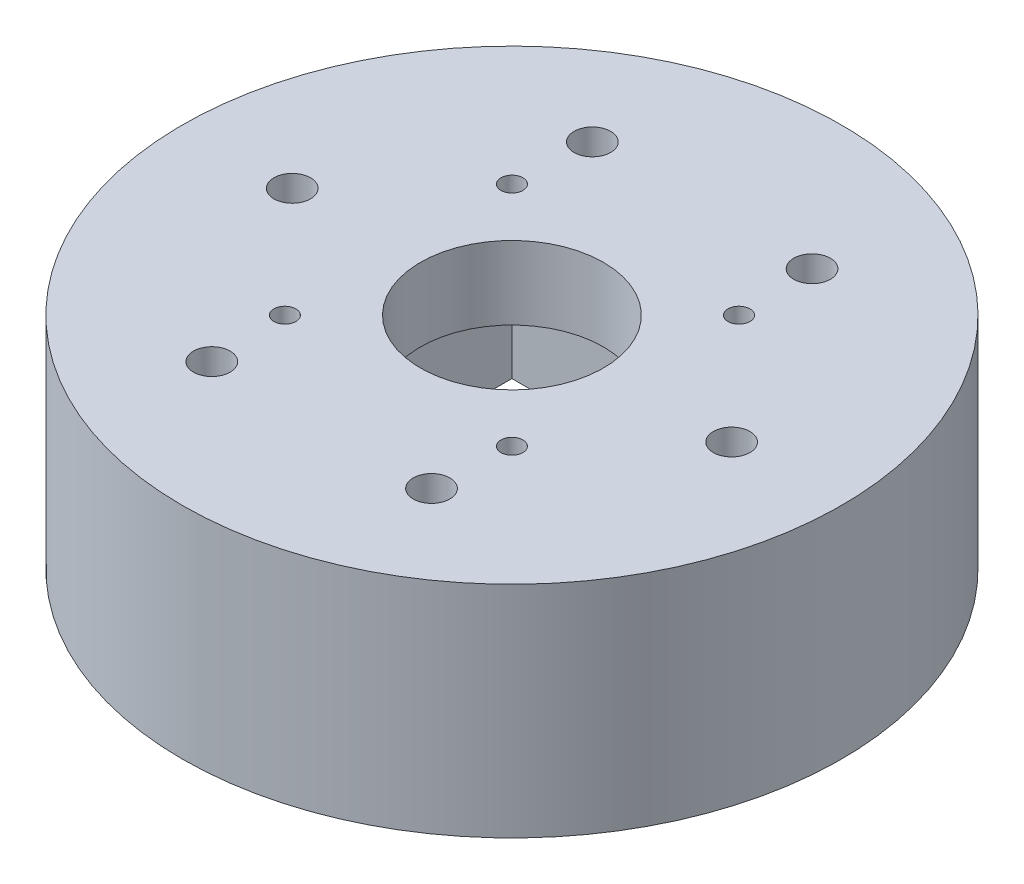
ISO-10303-21;
HEADER;
FILE_DESCRIPTION(('STEP AP214'),'2;1');
FILE_NAME('part.step','',(''),(''),'','','');
FILE_SCHEMA(('AUTOMOTIVE_DESIGN { 1 0 10303 214 1 1 1 1 }'));
ENDSEC;
DATA;
#1=APPLICATION_CONTEXT('core data for automotive mechanical design processes');
#2=APPLICATION_PROTOCOL_DEFINITION('international standard','automotive_design',2000,#1);
#3=PRODUCT_CONTEXT('',#1,'mechanical');
#4=PRODUCT('Part','Part','',(#3));
#5=PRODUCT_RELATED_PRODUCT_CATEGORY('part','',(#4));
#6=PRODUCT_DEFINITION_FORMATION('','',#4);
#7=PRODUCT_DEFINITION_CONTEXT('part definition',#1,'design');
#8=PRODUCT_DEFINITION('design','',#6,#7);
#9=PRODUCT_DEFINITION_SHAPE('','',#8);
#10=(LENGTH_UNIT() NAMED_UNIT(*) SI_UNIT(.MILLI.,.METRE.));
#11=(NAMED_UNIT(*) PLANE_ANGLE_UNIT() SI_UNIT($,.RADIAN.));
#12=(NAMED_UNIT(*) SI_UNIT($,.STERADIAN.) SOLID_ANGLE_UNIT());
#13=UNCERTAINTY_MEASURE_WITH_UNIT(LENGTH_MEASURE(1.E-05),#10,'distance_accuracy_value','');
#14=(GEOMETRIC_REPRESENTATION_CONTEXT(3) GLOBAL_UNCERTAINTY_ASSIGNED_CONTEXT((#13)) GLOBAL_UNIT_ASSIGNED_CONTEXT((#10,
#11,#12)) REPRESENTATION_CONTEXT('',''));
#15=CARTESIAN_POINT('',(0.,0.,0.));
#16=DIRECTION('',(0.,0.,1.));
#17=DIRECTION('',(1.,0.,0.));
#18=AXIS2_PLACEMENT_3D('',#15,#16,#17);
#19=CARTESIAN_POINT('',(0.,30.,0.));
#20=DIRECTION('',(0.,-1.,0.));
#21=DIRECTION('',(0.,0.,-1.));
#22=AXIS2_PLACEMENT_3D('',#19,#20,#21);
#23=CYLINDRICAL_SURFACE('',#22,45.);
#24=CARTESIAN_POINT('',(0.,30.,0.));
#25=DIRECTION('',(0.,1.,0.));
#26=DIRECTION('',(0.,0.,1.));
#27=AXIS2_PLACEMENT_3D('',#24,#25,#26);
#28=CIRCLE('',#27,45.);
#29=CARTESIAN_POINT('',(0.,30.,45.));
#30=VERTEX_POINT('',#29);
#31=EDGE_CURVE('E11',#30,#30,#28,.T.);
#32=ORIENTED_EDGE('',*,*,#31,.F.);
#33=EDGE_LOOP('',(#32));
#34=FACE_BOUND('',#33,.T.);
#35=CARTESIAN_POINT('',(0.,0.,0.));
#36=DIRECTION('',(0.,1.,0.));
#37=DIRECTION('',(0.,0.,1.));
#38=AXIS2_PLACEMENT_3D('',#35,#36,#37);
#39=CIRCLE('',#38,45.);
#40=CARTESIAN_POINT('',(0.,0.,45.));
#41=VERTEX_POINT('',#40);
#42=EDGE_CURVE('E35',#41,#41,#39,.T.);
#43=ORIENTED_EDGE('',*,*,#42,.T.);
#44=EDGE_LOOP('',(#43));
#45=FACE_BOUND('',#44,.T.);
#46=ADVANCED_FACE('F32',(#34,#45),#23,.T.);
#47=CARTESIAN_POINT('',(0.,30.,0.));
#48=DIRECTION('',(0.,1.,0.));
#49=DIRECTION('',(0.,0.,1.));
#50=AXIS2_PLACEMENT_3D('',#47,#48,#49);
#51=PLANE('',#50);
#52=CARTESIAN_POINT('',(-15.4999999999997,30.,-15.5));
#53=DIRECTION('',(0.,-1.,0.));
#54=DIRECTION('',(0.,0.,-1.));
#55=AXIS2_PLACEMENT_3D('',#52,#53,#54);
#56=CIRCLE('',#55,1.5);
#57=CARTESIAN_POINT('',(-15.4999999999997,30.,-17.));
#58=VERTEX_POINT('',#57);
#59=EDGE_CURVE('E281',#58,#58,#56,.T.);
#60=ORIENTED_EDGE('',*,*,#59,.T.);
#61=EDGE_LOOP('',(#60));
#62=FACE_BOUND('',#61,.T.);
#63=CARTESIAN_POINT('',(15.5000000000003,30.,-15.5));
#64=DIRECTION('',(0.,-1.,0.));
#65=DIRECTION('',(0.,0.,-1.));
#66=AXIS2_PLACEMENT_3D('',#63,#64,#65);
#67=CIRCLE('',#66,1.5);
#68=CARTESIAN_POINT('',(15.5000000000003,30.,-17.));
#69=VERTEX_POINT('',#68);
#70=EDGE_CURVE('E275',#69,#69,#67,.T.);
#71=ORIENTED_EDGE('',*,*,#70,.T.);
#72=EDGE_LOOP('',(#71));
#73=FACE_BOUND('',#72,.T.);
#74=CARTESIAN_POINT('',(0.,30.,0.));
#75=DIRECTION('',(0.,-1.,0.));
#76=DIRECTION('',(0.,0.,-1.));
#77=AXIS2_PLACEMENT_3D('',#74,#75,#76);
#78=CIRCLE('',#77,12.5);
#79=CARTESIAN_POINT('',(0.,30.,-12.5));
#80=VERTEX_POINT('',#79);
#81=EDGE_CURVE('E265',#80,#80,#78,.T.);
#82=ORIENTED_EDGE('',*,*,#81,.T.);
#83=EDGE_LOOP('',(#82));
#84=FACE_BOUND('',#83,.T.);
#85=CARTESIAN_POINT('',(15.5,30.,15.5));
#86=DIRECTION('',(0.,-1.,0.));
#87=DIRECTION('',(0.,0.,-1.));
#88=AXIS2_PLACEMENT_3D('',#85,#86,#87);
#89=CIRCLE('',#88,1.5);
#90=CARTESIAN_POINT('',(15.5,30.,14.));
#91=VERTEX_POINT('',#90);
#92=EDGE_CURVE('E260',#91,#91,#89,.T.);
#93=ORIENTED_EDGE('',*,*,#92,.T.);
#94=EDGE_LOOP('',(#93));
#95=FACE_BOUND('',#94,.T.);
#96=CARTESIAN_POINT('',(-15.5,30.,15.5));
#97=DIRECTION('',(0.,-1.,0.));
#98=DIRECTION('',(0.,0.,-1.));
#99=AXIS2_PLACEMENT_3D('',#96,#97,#98);
#100=CIRCLE('',#99,1.5);
#101=CARTESIAN_POINT('',(-15.5,30.,14.));
#102=VERTEX_POINT('',#101);
#103=EDGE_CURVE('E103',#102,#102,#100,.T.);
#104=ORIENTED_EDGE('',*,*,#103,.T.);
#105=EDGE_LOOP('',(#104));
#106=FACE_BOUND('',#105,.T.);
#107=CARTESIAN_POINT('',(30.,30.,0.));
#108=DIRECTION('',(0.,-1.,0.));
#109=DIRECTION('',(0.,0.,-1.));
#110=AXIS2_PLACEMENT_3D('',#107,#108,#109);
#111=CIRCLE('',#110,2.5);
#112=CARTESIAN_POINT('',(30.,30.,-2.5));
#113=VERTEX_POINT('',#112);
#114=EDGE_CURVE('E112',#113,#113,#111,.T.);
#115=ORIENTED_EDGE('',*,*,#114,.T.);
#116=EDGE_LOOP('',(#115));
#117=FACE_BOUND('',#116,.T.);
#118=CARTESIAN_POINT('',(15.,30.,25.9807621135332));
#119=DIRECTION('',(0.,-1.,0.));
#120=DIRECTION('',(0.,0.,-1.));
#121=AXIS2_PLACEMENT_3D('',#118,#119,#120);
#122=CIRCLE('',#121,2.5);
#123=CARTESIAN_POINT('',(15.,30.,23.4807621135332));
#124=VERTEX_POINT('',#123);
#125=EDGE_CURVE('E120',#124,#124,#122,.T.);
#126=ORIENTED_EDGE('',*,*,#125,.T.);
#127=EDGE_LOOP('',(#126));
#128=FACE_BOUND('',#127,.T.);
#129=CARTESIAN_POINT('',(-15.,30.,25.9807621135332));
#130=DIRECTION('',(0.,-1.,0.));
#131=DIRECTION('',(0.,0.,-1.));
#132=AXIS2_PLACEMENT_3D('',#129,#130,#131);
#133=CIRCLE('',#132,2.5);
#134=CARTESIAN_POINT('',(-15.,30.,23.4807621135331));
#135=VERTEX_POINT('',#134);
#136=EDGE_CURVE('E143',#135,#135,#133,.T.);
#137=ORIENTED_EDGE('',*,*,#136,.T.);
#138=EDGE_LOOP('',(#137));
#139=FACE_BOUND('',#138,.T.);
#140=CARTESIAN_POINT('',(-30.,30.,0.));
#141=DIRECTION('',(0.,-1.,0.));
#142=DIRECTION('',(0.,0.,-1.));
#143=AXIS2_PLACEMENT_3D('',#140,#141,#142);
#144=CIRCLE('',#143,2.5);
#145=CARTESIAN_POINT('',(-30.,30.,-2.50000000000001));
#146=VERTEX_POINT('',#145);
#147=EDGE_CURVE('E137',#146,#146,#144,.T.);
#148=ORIENTED_EDGE('',*,*,#147,.T.);
#149=EDGE_LOOP('',(#148));
#150=FACE_BOUND('',#149,.T.);
#151=CARTESIAN_POINT('',(-15.,30.,-25.9807621135332));
#152=DIRECTION('',(0.,-1.,0.));
#153=DIRECTION('',(0.,0.,-1.));
#154=AXIS2_PLACEMENT_3D('',#151,#152,#153);
#155=CIRCLE('',#154,2.50000000000001);
#156=CARTESIAN_POINT('',(-15.,30.,-28.4807621135332));
#157=VERTEX_POINT('',#156);
#158=EDGE_CURVE('E131',#157,#157,#155,.T.);
#159=ORIENTED_EDGE('',*,*,#158,.T.);
#160=EDGE_LOOP('',(#159));
#161=FACE_BOUND('',#160,.T.);
#162=CARTESIAN_POINT('',(15.,30.,-25.9807621135332));
#163=DIRECTION('',(0.,-1.,0.));
#164=DIRECTION('',(0.,0.,-1.));
#165=AXIS2_PLACEMENT_3D('',#162,#163,#164);
#166=CIRCLE('',#165,2.5);
#167=CARTESIAN_POINT('',(15.,30.,-28.4807621135332));
#168=VERTEX_POINT('',#167);
#169=EDGE_CURVE('E119',#168,#168,#166,.T.);
#170=ORIENTED_EDGE('',*,*,#169,.T.);
#171=EDGE_LOOP('',(#170));
#172=FACE_BOUND('',#171,.T.);
#173=ORIENTED_EDGE('',*,*,#31,.T.);
#174=EDGE_LOOP('',(#173));
#175=FACE_BOUND('',#174,.T.);
#176=ADVANCED_FACE('F165',(#62,#73,#84,#95,#106,#117,#128,#139,#150,#161,#172,#175),#51,.T.);
#177=CARTESIAN_POINT('',(0.,0.,0.));
#178=DIRECTION('',(0.,1.,0.));
#179=DIRECTION('',(0.,0.,1.));
#180=AXIS2_PLACEMENT_3D('',#177,#178,#179);
#181=PLANE('',#180);
#182=DIRECTION('',(-1.,0.,0.));
#183=VECTOR('',#182,1.);
#184=CARTESIAN_POINT('',(-22.5,0.,22.5));
#185=LINE('',#184,#183);
#186=CARTESIAN_POINT('',(22.5,0.,22.5));
#187=VERTEX_POINT('',#186);
#188=CARTESIAN_POINT('',(-22.5,0.,22.5));
#189=VERTEX_POINT('',#188);
#190=EDGE_CURVE('E81',#187,#189,#185,.T.);
#191=ORIENTED_EDGE('',*,*,#190,.F.);
#192=DIRECTION('',(0.,0.,1.));
#193=VECTOR('',#192,1.);
#194=CARTESIAN_POINT('',(22.5,0.,22.5));
#195=LINE('',#194,#193);
#196=CARTESIAN_POINT('',(22.5,0.,-22.5));
#197=VERTEX_POINT('',#196);
#198=EDGE_CURVE('E46',#197,#187,#195,.T.);
#199=ORIENTED_EDGE('',*,*,#198,.F.);
#200=DIRECTION('',(1.,0.,0.));
#201=VECTOR('',#200,1.);
#202=CARTESIAN_POINT('',(-22.5,0.,-22.5));
#203=LINE('',#202,#201);
#204=CARTESIAN_POINT('',(-22.5,0.,-22.5));
#205=VERTEX_POINT('',#204);
#206=EDGE_CURVE('E97',#205,#197,#203,.T.);
#207=ORIENTED_EDGE('',*,*,#206,.F.);
#208=DIRECTION('',(0.,0.,-1.));
#209=VECTOR('',#208,1.);
#210=CARTESIAN_POINT('',(-22.5,0.,22.5));
#211=LINE('',#210,#209);
#212=EDGE_CURVE('E105',#189,#205,#211,.T.);
#213=ORIENTED_EDGE('',*,*,#212,.F.);
#214=EDGE_LOOP('',(#191,#199,#207,#213));
#215=FACE_BOUND('',#214,.T.);
#216=CARTESIAN_POINT('',(30.,0.,0.));
#217=DIRECTION('',(0.,-1.,0.));
#218=DIRECTION('',(0.,0.,-1.));
#219=AXIS2_PLACEMENT_3D('',#216,#217,#218);
#220=CIRCLE('',#219,2.5);
#221=CARTESIAN_POINT('',(30.,0.,-2.5));
#222=VERTEX_POINT('',#221);
#223=EDGE_CURVE('E116',#222,#222,#220,.T.);
#224=ORIENTED_EDGE('',*,*,#223,.F.);
#225=EDGE_LOOP('',(#224));
#226=FACE_BOUND('',#225,.T.);
#227=CARTESIAN_POINT('',(15.,0.,25.9807621135332));
#228=DIRECTION('',(0.,-1.,0.));
#229=DIRECTION('',(0.,0.,-1.));
#230=AXIS2_PLACEMENT_3D('',#227,#228,#229);
#231=CIRCLE('',#230,2.5);
#232=CARTESIAN_POINT('',(15.,0.,23.4807621135332));
#233=VERTEX_POINT('',#232);
#234=EDGE_CURVE('E109',#233,#233,#231,.T.);
#235=ORIENTED_EDGE('',*,*,#234,.F.);
#236=EDGE_LOOP('',(#235));
#237=FACE_BOUND('',#236,.T.);
#238=CARTESIAN_POINT('',(-15.,0.,25.9807621135332));
#239=DIRECTION('',(0.,-1.,0.));
#240=DIRECTION('',(0.,0.,-1.));
#241=AXIS2_PLACEMENT_3D('',#238,#239,#240);
#242=CIRCLE('',#241,2.5);
#243=CARTESIAN_POINT('',(-15.,0.,23.4807621135331));
#244=VERTEX_POINT('',#243);
#245=EDGE_CURVE('E123',#244,#244,#242,.T.);
#246=ORIENTED_EDGE('',*,*,#245,.F.);
#247=EDGE_LOOP('',(#246));
#248=FACE_BOUND('',#247,.T.);
#249=CARTESIAN_POINT('',(-30.,0.,0.));
#250=DIRECTION('',(0.,-1.,0.));
#251=DIRECTION('',(0.,0.,-1.));
#252=AXIS2_PLACEMENT_3D('',#249,#250,#251);
#253=CIRCLE('',#252,2.5);
#254=CARTESIAN_POINT('',(-30.,0.,-2.50000000000001));
#255=VERTEX_POINT('',#254);
#256=EDGE_CURVE('E140',#255,#255,#253,.T.);
#257=ORIENTED_EDGE('',*,*,#256,.F.);
#258=EDGE_LOOP('',(#257));
#259=FACE_BOUND('',#258,.T.);
#260=CARTESIAN_POINT('',(-15.,0.,-25.9807621135332));
#261=DIRECTION('',(0.,-1.,0.));
#262=DIRECTION('',(0.,0.,-1.));
#263=AXIS2_PLACEMENT_3D('',#260,#261,#262);
#264=CIRCLE('',#263,2.50000000000001);
#265=CARTESIAN_POINT('',(-15.,0.,-28.4807621135332));
#266=VERTEX_POINT('',#265);
#267=EDGE_CURVE('E134',#266,#266,#264,.T.);
#268=ORIENTED_EDGE('',*,*,#267,.F.);
#269=EDGE_LOOP('',(#268));
#270=FACE_BOUND('',#269,.T.);
#271=CARTESIAN_POINT('',(15.,0.,-25.9807621135332));
#272=DIRECTION('',(0.,-1.,0.));
#273=DIRECTION('',(0.,0.,-1.));
#274=AXIS2_PLACEMENT_3D('',#271,#272,#273);
#275=CIRCLE('',#274,2.5);
#276=CARTESIAN_POINT('',(15.,0.,-28.4807621135332));
#277=VERTEX_POINT('',#276);
#278=EDGE_CURVE('E128',#277,#277,#275,.T.);
#279=ORIENTED_EDGE('',*,*,#278,.F.);
#280=EDGE_LOOP('',(#279));
#281=FACE_BOUND('',#280,.T.);
#282=CARTESIAN_POINT('',(0.,0.,32.5));
#283=DIRECTION('',(0.,-1.,0.));
#284=DIRECTION('',(0.,0.,-1.));
#285=AXIS2_PLACEMENT_3D('',#282,#283,#284);
#286=CIRCLE('',#285,4.);
#287=CARTESIAN_POINT('',(0.,0.,28.5));
#288=VERTEX_POINT('',#287);
#289=EDGE_CURVE('E151',#288,#288,#286,.T.);
#290=ORIENTED_EDGE('',*,*,#289,.F.);
#291=EDGE_LOOP('',(#290));
#292=FACE_BOUND('',#291,.T.);
#293=CARTESIAN_POINT('',(0.,0.,-32.5));
#294=DIRECTION('',(0.,-1.,0.));
#295=DIRECTION('',(0.,0.,-1.));
#296=AXIS2_PLACEMENT_3D('',#293,#294,#295);
#297=CIRCLE('',#296,4.);
#298=CARTESIAN_POINT('',(0.,0.,-36.5));
#299=VERTEX_POINT('',#298);
#300=EDGE_CURVE('E115',#299,#299,#297,.T.);
#301=ORIENTED_EDGE('',*,*,#300,.F.);
#302=EDGE_LOOP('',(#301));
#303=FACE_BOUND('',#302,.T.);
#304=ORIENTED_EDGE('',*,*,#42,.F.);
#305=EDGE_LOOP('',(#304));
#306=FACE_BOUND('',#305,.T.);
#307=ADVANCED_FACE('F162',(#215,#226,#237,#248,#259,#270,#281,#292,#303,#306),#181,.F.);
#308=CARTESIAN_POINT('',(0.,20.,-32.5));
#309=DIRECTION('',(0.,-1.,0.));
#310=DIRECTION('',(0.,0.,-1.));
#311=AXIS2_PLACEMENT_3D('',#308,#309,#310);
#312=CYLINDRICAL_SURFACE('',#311,4.);
#313=CARTESIAN_POINT('',(0.,20.,-32.5));
#314=DIRECTION('',(0.,-1.,0.));
#315=DIRECTION('',(0.,0.,-1.));
#316=AXIS2_PLACEMENT_3D('',#313,#314,#315);
#317=CIRCLE('',#316,4.);
#318=CARTESIAN_POINT('',(0.,20.,-36.5));
#319=VERTEX_POINT('',#318);
#320=EDGE_CURVE('E154',#319,#319,#317,.T.);
#321=ORIENTED_EDGE('',*,*,#320,.F.);
#322=EDGE_LOOP('',(#321));
#323=FACE_BOUND('',#322,.T.);
#324=ORIENTED_EDGE('',*,*,#300,.T.);
#325=EDGE_LOOP('',(#324));
#326=FACE_BOUND('',#325,.T.);
#327=ADVANCED_FACE('F160',(#323,#326),#312,.F.);
#328=CARTESIAN_POINT('',(0.,20.,-32.5));
#329=DIRECTION('',(0.,-1.,0.));
#330=DIRECTION('',(0.,0.,-1.));
#331=AXIS2_PLACEMENT_3D('',#328,#329,#330);
#332=PLANE('',#331);
#333=ORIENTED_EDGE('',*,*,#320,.T.);
#334=EDGE_LOOP('',(#333));
#335=FACE_BOUND('',#334,.T.);
#336=ADVANCED_FACE('F186',(#335),#332,.T.);
#337=CARTESIAN_POINT('',(0.,20.,32.5));
#338=DIRECTION('',(0.,-1.,0.));
#339=DIRECTION('',(0.,0.,-1.));
#340=AXIS2_PLACEMENT_3D('',#337,#338,#339);
#341=CYLINDRICAL_SURFACE('',#340,4.);
#342=CARTESIAN_POINT('',(0.,20.,32.5));
#343=DIRECTION('',(0.,-1.,0.));
#344=DIRECTION('',(0.,0.,-1.));
#345=AXIS2_PLACEMENT_3D('',#342,#343,#344);
#346=CIRCLE('',#345,4.);
#347=CARTESIAN_POINT('',(0.,20.,28.5));
#348=VERTEX_POINT('',#347);
#349=EDGE_CURVE('E148',#348,#348,#346,.T.);
#350=ORIENTED_EDGE('',*,*,#349,.F.);
#351=EDGE_LOOP('',(#350));
#352=FACE_BOUND('',#351,.T.);
#353=ORIENTED_EDGE('',*,*,#289,.T.);
#354=EDGE_LOOP('',(#353));
#355=FACE_BOUND('',#354,.T.);
#356=ADVANCED_FACE('F190',(#352,#355),#341,.F.);
#357=CARTESIAN_POINT('',(0.,20.,32.5));
#358=DIRECTION('',(0.,-1.,0.));
#359=DIRECTION('',(0.,0.,-1.));
#360=AXIS2_PLACEMENT_3D('',#357,#358,#359);
#361=PLANE('',#360);
#362=ORIENTED_EDGE('',*,*,#349,.T.);
#363=EDGE_LOOP('',(#362));
#364=FACE_BOUND('',#363,.T.);
#365=ADVANCED_FACE('F194',(#364),#361,.T.);
#366=CARTESIAN_POINT('',(15.,30.,-25.9807621135332));
#367=DIRECTION('',(0.,-1.,0.));
#368=DIRECTION('',(0.,0.,-1.));
#369=AXIS2_PLACEMENT_3D('',#366,#367,#368);
#370=CYLINDRICAL_SURFACE('',#369,2.5);
#371=ORIENTED_EDGE('',*,*,#169,.F.);
#372=EDGE_LOOP('',(#371));
#373=FACE_BOUND('',#372,.T.);
#374=ORIENTED_EDGE('',*,*,#278,.T.);
#375=EDGE_LOOP('',(#374));
#376=FACE_BOUND('',#375,.T.);
#377=ADVANCED_FACE('F198',(#373,#376),#370,.F.);
#378=CARTESIAN_POINT('',(-15.,30.,-25.9807621135332));
#379=DIRECTION('',(0.,-1.,0.));
#380=DIRECTION('',(0.,0.,-1.));
#381=AXIS2_PLACEMENT_3D('',#378,#379,#380);
#382=CYLINDRICAL_SURFACE('',#381,2.50000000000001);
#383=ORIENTED_EDGE('',*,*,#158,.F.);
#384=EDGE_LOOP('',(#383));
#385=FACE_BOUND('',#384,.T.);
#386=ORIENTED_EDGE('',*,*,#267,.T.);
#387=EDGE_LOOP('',(#386));
#388=FACE_BOUND('',#387,.T.);
#389=ADVANCED_FACE('F208',(#385,#388),#382,.F.);
#390=CARTESIAN_POINT('',(-30.,30.,0.));
#391=DIRECTION('',(0.,-1.,0.));
#392=DIRECTION('',(0.,0.,-1.));
#393=AXIS2_PLACEMENT_3D('',#390,#391,#392);
#394=CYLINDRICAL_SURFACE('',#393,2.5);
#395=ORIENTED_EDGE('',*,*,#147,.F.);
#396=EDGE_LOOP('',(#395));
#397=FACE_BOUND('',#396,.T.);
#398=ORIENTED_EDGE('',*,*,#256,.T.);
#399=EDGE_LOOP('',(#398));
#400=FACE_BOUND('',#399,.T.);
#401=ADVANCED_FACE('F204',(#397,#400),#394,.F.);
#402=CARTESIAN_POINT('',(-15.,30.,25.9807621135332));
#403=DIRECTION('',(0.,-1.,0.));
#404=DIRECTION('',(0.,0.,-1.));
#405=AXIS2_PLACEMENT_3D('',#402,#403,#404);
#406=CYLINDRICAL_SURFACE('',#405,2.5);
#407=ORIENTED_EDGE('',*,*,#136,.F.);
#408=EDGE_LOOP('',(#407));
#409=FACE_BOUND('',#408,.T.);
#410=ORIENTED_EDGE('',*,*,#245,.T.);
#411=EDGE_LOOP('',(#410));
#412=FACE_BOUND('',#411,.T.);
#413=ADVANCED_FACE('F200',(#409,#412),#406,.F.);
#414=CARTESIAN_POINT('',(15.,30.,25.9807621135332));
#415=DIRECTION('',(0.,-1.,0.));
#416=DIRECTION('',(0.,0.,-1.));
#417=AXIS2_PLACEMENT_3D('',#414,#415,#416);
#418=CYLINDRICAL_SURFACE('',#417,2.5);
#419=ORIENTED_EDGE('',*,*,#125,.F.);
#420=EDGE_LOOP('',(#419));
#421=FACE_BOUND('',#420,.T.);
#422=ORIENTED_EDGE('',*,*,#234,.T.);
#423=EDGE_LOOP('',(#422));
#424=FACE_BOUND('',#423,.T.);
#425=ADVANCED_FACE('F203',(#421,#424),#418,.F.);
#426=CARTESIAN_POINT('',(30.,30.,0.));
#427=DIRECTION('',(0.,-1.,0.));
#428=DIRECTION('',(0.,0.,-1.));
#429=AXIS2_PLACEMENT_3D('',#426,#427,#428);
#430=CYLINDRICAL_SURFACE('',#429,2.5);
#431=ORIENTED_EDGE('',*,*,#114,.F.);
#432=EDGE_LOOP('',(#431));
#433=FACE_BOUND('',#432,.T.);
#434=ORIENTED_EDGE('',*,*,#223,.T.);
#435=EDGE_LOOP('',(#434));
#436=FACE_BOUND('',#435,.T.);
#437=ADVANCED_FACE('F218',(#433,#436),#430,.F.);
#438=CARTESIAN_POINT('',(22.5,20.,22.5));
#439=DIRECTION('',(1.,0.,0.));
#440=DIRECTION('',(0.,0.,-1.));
#441=AXIS2_PLACEMENT_3D('',#438,#439,#440);
#442=PLANE('',#441);
#443=ORIENTED_EDGE('',*,*,#198,.T.);
#444=DIRECTION('',(0.,-1.,0.));
#445=VECTOR('',#444,1.);
#446=CARTESIAN_POINT('',(22.5,20.,22.5));
#447=LINE('',#446,#445);
#448=CARTESIAN_POINT('',(22.5,20.,22.5));
#449=VERTEX_POINT('',#448);
#450=EDGE_CURVE('E69',#449,#187,#447,.T.);
#451=ORIENTED_EDGE('',*,*,#450,.F.);
#452=DIRECTION('',(0.,0.,1.));
#453=VECTOR('',#452,1.);
#454=CARTESIAN_POINT('',(22.5,20.,22.5));
#455=LINE('',#454,#453);
#456=CARTESIAN_POINT('',(22.5,20.,-22.5));
#457=VERTEX_POINT('',#456);
#458=EDGE_CURVE('E95',#457,#449,#455,.T.);
#459=ORIENTED_EDGE('',*,*,#458,.F.);
#460=DIRECTION('',(0.,-1.,0.));
#461=VECTOR('',#460,1.);
#462=CARTESIAN_POINT('',(22.5,20.,-22.5));
#463=LINE('',#462,#461);
#464=EDGE_CURVE('E54',#457,#197,#463,.T.);
#465=ORIENTED_EDGE('',*,*,#464,.T.);
#466=EDGE_LOOP('',(#443,#451,#459,#465));
#467=FACE_BOUND('',#466,.T.);
#468=ADVANCED_FACE('F222',(#467),#442,.F.);
#469=CARTESIAN_POINT('',(-22.5,20.,-22.5));
#470=DIRECTION('',(0.,0.,-1.));
#471=DIRECTION('',(-1.,0.,0.));
#472=AXIS2_PLACEMENT_3D('',#469,#470,#471);
#473=PLANE('',#472);
#474=ORIENTED_EDGE('',*,*,#206,.T.);
#475=ORIENTED_EDGE('',*,*,#464,.F.);
#476=DIRECTION('',(1.,0.,0.));
#477=VECTOR('',#476,1.);
#478=CARTESIAN_POINT('',(-22.5,20.,-22.5));
#479=LINE('',#478,#477);
#480=CARTESIAN_POINT('',(-22.5,20.,-22.5));
#481=VERTEX_POINT('',#480);
#482=EDGE_CURVE('E92',#481,#457,#479,.T.);
#483=ORIENTED_EDGE('',*,*,#482,.F.);
#484=DIRECTION('',(0.,-1.,0.));
#485=VECTOR('',#484,1.);
#486=CARTESIAN_POINT('',(-22.5,20.,-22.5));
#487=LINE('',#486,#485);
#488=EDGE_CURVE('E85',#481,#205,#487,.T.);
#489=ORIENTED_EDGE('',*,*,#488,.T.);
#490=EDGE_LOOP('',(#474,#475,#483,#489));
#491=FACE_BOUND('',#490,.T.);
#492=ADVANCED_FACE('F226',(#491),#473,.F.);
#493=CARTESIAN_POINT('',(-22.5,20.,22.5));
#494=DIRECTION('',(-1.,0.,0.));
#495=DIRECTION('',(0.,0.,1.));
#496=AXIS2_PLACEMENT_3D('',#493,#494,#495);
#497=PLANE('',#496);
#498=ORIENTED_EDGE('',*,*,#212,.T.);
#499=ORIENTED_EDGE('',*,*,#488,.F.);
#500=DIRECTION('',(0.,0.,-1.));
#501=VECTOR('',#500,1.);
#502=CARTESIAN_POINT('',(-22.5,20.,22.5));
#503=LINE('',#502,#501);
#504=CARTESIAN_POINT('',(-22.5,20.,22.5));
#505=VERTEX_POINT('',#504);
#506=EDGE_CURVE('E88',#505,#481,#503,.T.);
#507=ORIENTED_EDGE('',*,*,#506,.F.);
#508=DIRECTION('',(0.,-1.,0.));
#509=VECTOR('',#508,1.);
#510=CARTESIAN_POINT('',(-22.5,20.,22.5));
#511=LINE('',#510,#509);
#512=EDGE_CURVE('E74',#505,#189,#511,.T.);
#513=ORIENTED_EDGE('',*,*,#512,.T.);
#514=EDGE_LOOP('',(#498,#499,#507,#513));
#515=FACE_BOUND('',#514,.T.);
#516=ADVANCED_FACE('F89',(#515),#497,.F.);
#517=CARTESIAN_POINT('',(-22.5,20.,22.5));
#518=DIRECTION('',(0.,0.,1.));
#519=DIRECTION('',(1.,0.,0.));
#520=AXIS2_PLACEMENT_3D('',#517,#518,#519);
#521=PLANE('',#520);
#522=ORIENTED_EDGE('',*,*,#190,.T.);
#523=ORIENTED_EDGE('',*,*,#512,.F.);
#524=DIRECTION('',(-1.,0.,0.));
#525=VECTOR('',#524,1.);
#526=CARTESIAN_POINT('',(-22.5,20.,22.5));
#527=LINE('',#526,#525);
#528=EDGE_CURVE('E78',#449,#505,#527,.T.);
#529=ORIENTED_EDGE('',*,*,#528,.F.);
#530=ORIENTED_EDGE('',*,*,#450,.T.);
#531=EDGE_LOOP('',(#522,#523,#529,#530));
#532=FACE_BOUND('',#531,.T.);
#533=ADVANCED_FACE('F76',(#532),#521,.F.);
#534=CARTESIAN_POINT('',(0.,20.,0.));
#535=DIRECTION('',(0.,-1.,0.));
#536=DIRECTION('',(0.,0.,-1.));
#537=AXIS2_PLACEMENT_3D('',#534,#535,#536);
#538=PLANE('',#537);
#539=CARTESIAN_POINT('',(0.,20.,0.));
#540=DIRECTION('',(0.,-1.,0.));
#541=DIRECTION('',(0.,0.,-1.));
#542=AXIS2_PLACEMENT_3D('',#539,#540,#541);
#543=CIRCLE('',#542,12.5);
#544=CARTESIAN_POINT('',(0.,20.,-12.5));
#545=VERTEX_POINT('',#544);
#546=EDGE_CURVE('E270',#545,#545,#543,.T.);
#547=ORIENTED_EDGE('',*,*,#546,.F.);
#548=EDGE_LOOP('',(#547));
#549=FACE_BOUND('',#548,.T.);
#550=CARTESIAN_POINT('',(-15.4999999999997,20.,-15.5));
#551=DIRECTION('',(0.,-1.,0.));
#552=DIRECTION('',(0.,0.,-1.));
#553=AXIS2_PLACEMENT_3D('',#550,#551,#552);
#554=CIRCLE('',#553,1.5);
#555=CARTESIAN_POINT('',(-15.4999999999997,20.,-17.));
#556=VERTEX_POINT('',#555);
#557=EDGE_CURVE('E283',#556,#556,#554,.T.);
#558=ORIENTED_EDGE('',*,*,#557,.F.);
#559=EDGE_LOOP('',(#558));
#560=FACE_BOUND('',#559,.T.);
#561=CARTESIAN_POINT('',(15.5000000000003,20.,-15.5));
#562=DIRECTION('',(0.,-1.,0.));
#563=DIRECTION('',(0.,0.,-1.));
#564=AXIS2_PLACEMENT_3D('',#561,#562,#563);
#565=CIRCLE('',#564,1.5);
#566=CARTESIAN_POINT('',(15.5000000000003,20.,-17.));
#567=VERTEX_POINT('',#566);
#568=EDGE_CURVE('E278',#567,#567,#565,.T.);
#569=ORIENTED_EDGE('',*,*,#568,.F.);
#570=EDGE_LOOP('',(#569));
#571=FACE_BOUND('',#570,.T.);
#572=CARTESIAN_POINT('',(15.5,20.,15.5));
#573=DIRECTION('',(0.,-1.,0.));
#574=DIRECTION('',(0.,0.,-1.));
#575=AXIS2_PLACEMENT_3D('',#572,#573,#574);
#576=CIRCLE('',#575,1.5);
#577=CARTESIAN_POINT('',(15.5,20.,14.));
#578=VERTEX_POINT('',#577);
#579=EDGE_CURVE('E263',#578,#578,#576,.T.);
#580=ORIENTED_EDGE('',*,*,#579,.F.);
#581=EDGE_LOOP('',(#580));
#582=FACE_BOUND('',#581,.T.);
#583=CARTESIAN_POINT('',(-15.5,20.,15.5));
#584=DIRECTION('',(0.,-1.,0.));
#585=DIRECTION('',(0.,0.,-1.));
#586=AXIS2_PLACEMENT_3D('',#583,#584,#585);
#587=CIRCLE('',#586,1.5);
#588=CARTESIAN_POINT('',(-15.5,20.,14.));
#589=VERTEX_POINT('',#588);
#590=EDGE_CURVE('E267',#589,#589,#587,.T.);
#591=ORIENTED_EDGE('',*,*,#590,.F.);
#592=EDGE_LOOP('',(#591));
#593=FACE_BOUND('',#592,.T.);
#594=ORIENTED_EDGE('',*,*,#458,.T.);
#595=ORIENTED_EDGE('',*,*,#528,.T.);
#596=ORIENTED_EDGE('',*,*,#506,.T.);
#597=ORIENTED_EDGE('',*,*,#482,.T.);
#598=EDGE_LOOP('',(#594,#595,#596,#597));
#599=FACE_BOUND('',#598,.T.);
#600=ADVANCED_FACE('F94',(#549,#560,#571,#582,#593,#599),#538,.T.);
#601=CARTESIAN_POINT('',(-15.5,30.,15.5));
#602=DIRECTION('',(0.,-1.,0.));
#603=DIRECTION('',(0.,0.,-1.));
#604=AXIS2_PLACEMENT_3D('',#601,#602,#603);
#605=CYLINDRICAL_SURFACE('',#604,1.5);
#606=ORIENTED_EDGE('',*,*,#103,.F.);
#607=EDGE_LOOP('',(#606));
#608=FACE_BOUND('',#607,.T.);
#609=ORIENTED_EDGE('',*,*,#590,.T.);
#610=EDGE_LOOP('',(#609));
#611=FACE_BOUND('',#610,.T.);
#612=ADVANCED_FACE('F235',(#608,#611),#605,.F.);
#613=CARTESIAN_POINT('',(15.5,30.,15.5));
#614=DIRECTION('',(0.,-1.,0.));
#615=DIRECTION('',(0.,0.,-1.));
#616=AXIS2_PLACEMENT_3D('',#613,#614,#615);
#617=CYLINDRICAL_SURFACE('',#616,1.5);
#618=ORIENTED_EDGE('',*,*,#92,.F.);
#619=EDGE_LOOP('',(#618));
#620=FACE_BOUND('',#619,.T.);
#621=ORIENTED_EDGE('',*,*,#579,.T.);
#622=EDGE_LOOP('',(#621));
#623=FACE_BOUND('',#622,.T.);
#624=ADVANCED_FACE('F239',(#620,#623),#617,.F.);
#625=CARTESIAN_POINT('',(15.5000000000003,30.,-15.5));
#626=DIRECTION('',(0.,-1.,0.));
#627=DIRECTION('',(0.,0.,-1.));
#628=AXIS2_PLACEMENT_3D('',#625,#626,#627);
#629=CYLINDRICAL_SURFACE('',#628,1.5);
#630=ORIENTED_EDGE('',*,*,#70,.F.);
#631=EDGE_LOOP('',(#630));
#632=FACE_BOUND('',#631,.T.);
#633=ORIENTED_EDGE('',*,*,#568,.T.);
#634=EDGE_LOOP('',(#633));
#635=FACE_BOUND('',#634,.T.);
#636=ADVANCED_FACE('F245',(#632,#635),#629,.F.);
#637=CARTESIAN_POINT('',(-15.4999999999997,30.,-15.5));
#638=DIRECTION('',(0.,-1.,0.));
#639=DIRECTION('',(0.,0.,-1.));
#640=AXIS2_PLACEMENT_3D('',#637,#638,#639);
#641=CYLINDRICAL_SURFACE('',#640,1.5);
#642=ORIENTED_EDGE('',*,*,#59,.F.);
#643=EDGE_LOOP('',(#642));
#644=FACE_BOUND('',#643,.T.);
#645=ORIENTED_EDGE('',*,*,#557,.T.);
#646=EDGE_LOOP('',(#645));
#647=FACE_BOUND('',#646,.T.);
#648=ADVANCED_FACE('F241',(#644,#647),#641,.F.);
#649=CARTESIAN_POINT('',(0.,30.,0.));
#650=DIRECTION('',(0.,-1.,0.));
#651=DIRECTION('',(0.,0.,-1.));
#652=AXIS2_PLACEMENT_3D('',#649,#650,#651);
#653=CYLINDRICAL_SURFACE('',#652,12.5);
#654=ORIENTED_EDGE('',*,*,#81,.F.);
#655=EDGE_LOOP('',(#654));
#656=FACE_BOUND('',#655,.T.);
#657=ORIENTED_EDGE('',*,*,#546,.T.);
#658=EDGE_LOOP('',(#657));
#659=FACE_BOUND('',#658,.T.);
#660=ADVANCED_FACE('F244',(#656,#659),#653,.F.);
#661=CLOSED_SHELL('',(#46,#176,#307,#327,#336,#356,#365,#377,#389,#401,#413,#425,#437,#468,#492,
#516,#533,#600,#612,#624,#636,#648,#660));
#662=MANIFOLD_SOLID_BREP('B2',#661);
#663=ADVANCED_BREP_SHAPE_REPRESENTATION('',(#18,#662),#14);
#664=SHAPE_DEFINITION_REPRESENTATION(#9,#663);
ENDSEC;
END-ISO-10303-21;
